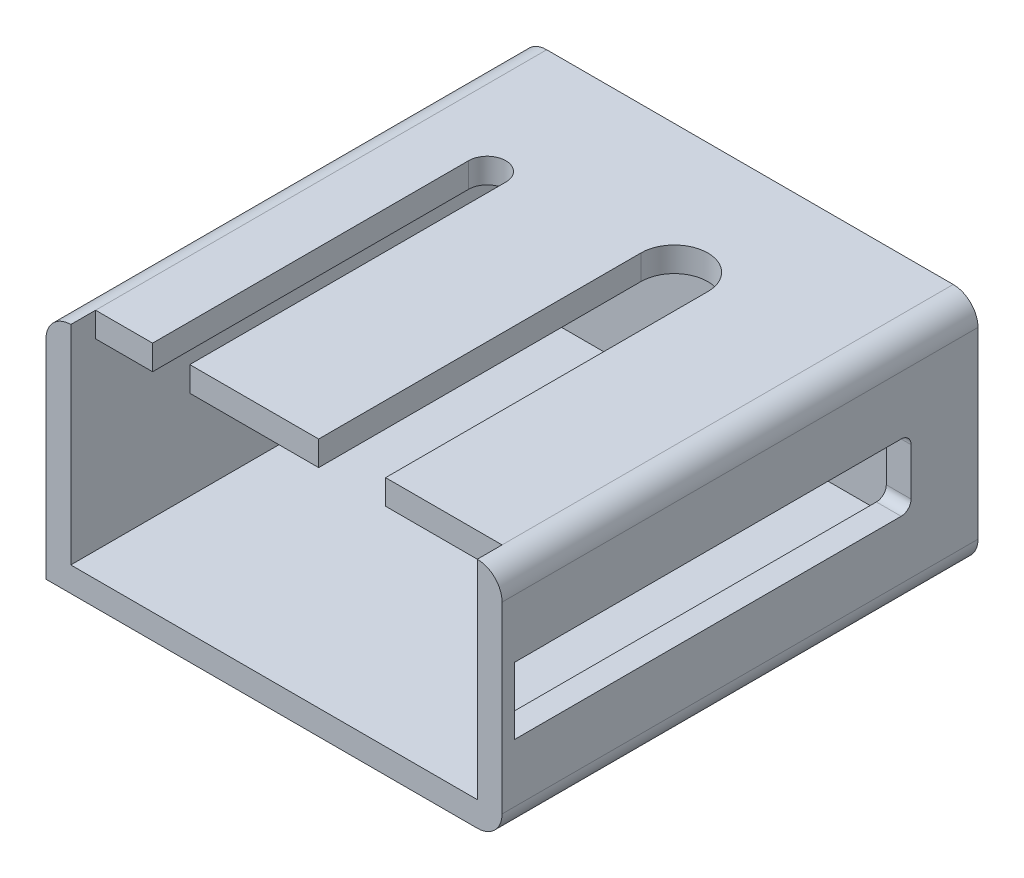
ISO-10303-21;
HEADER;
FILE_DESCRIPTION(('STEP AP214'),'2;1');
FILE_NAME('part.step','',(''),(''),'','','');
FILE_SCHEMA(('AUTOMOTIVE_DESIGN { 1 0 10303 214 1 1 1 1 }'));
ENDSEC;
DATA;
#1=APPLICATION_CONTEXT('core data for automotive mechanical design processes');
#2=APPLICATION_PROTOCOL_DEFINITION('international standard','automotive_design',2000,#1);
#3=PRODUCT_CONTEXT('',#1,'mechanical');
#4=PRODUCT('Part','Part','',(#3));
#5=PRODUCT_RELATED_PRODUCT_CATEGORY('part','',(#4));
#6=PRODUCT_DEFINITION_FORMATION('','',#4);
#7=PRODUCT_DEFINITION_CONTEXT('part definition',#1,'design');
#8=PRODUCT_DEFINITION('design','',#6,#7);
#9=PRODUCT_DEFINITION_SHAPE('','',#8);
#10=(LENGTH_UNIT() NAMED_UNIT(*) SI_UNIT(.MILLI.,.METRE.));
#11=(NAMED_UNIT(*) PLANE_ANGLE_UNIT() SI_UNIT($,.RADIAN.));
#12=(NAMED_UNIT(*) SI_UNIT($,.STERADIAN.) SOLID_ANGLE_UNIT());
#13=UNCERTAINTY_MEASURE_WITH_UNIT(LENGTH_MEASURE(1.E-05),#10,'distance_accuracy_value','');
#14=(GEOMETRIC_REPRESENTATION_CONTEXT(3) GLOBAL_UNCERTAINTY_ASSIGNED_CONTEXT((#13)) GLOBAL_UNIT_ASSIGNED_CONTEXT((#10,
#11,#12)) REPRESENTATION_CONTEXT('',''));
#15=CARTESIAN_POINT('',(0.,0.,0.));
#16=DIRECTION('',(0.,0.,1.));
#17=DIRECTION('',(1.,0.,0.));
#18=AXIS2_PLACEMENT_3D('',#15,#16,#17);
#19=CARTESIAN_POINT('',(82.,37.,-410.620424934226));
#20=DIRECTION('',(0.,1.,0.));
#21=DIRECTION('',(0.,0.,1.));
#22=AXIS2_PLACEMENT_3D('',#19,#20,#21);
#23=PLANE('',#22);
#24=DIRECTION('',(1.,0.,0.));
#25=VECTOR('',#24,1.);
#26=CARTESIAN_POINT('',(0.,37.,-10.));
#27=LINE('',#26,#25);
#28=CARTESIAN_POINT('',(35.0000000000001,37.,-10.));
#29=VERTEX_POINT('',#28);
#30=CARTESIAN_POINT('',(82.,37.,-10.));
#31=VERTEX_POINT('',#30);
#32=EDGE_CURVE('E851',#29,#31,#27,.T.);
#33=ORIENTED_EDGE('',*,*,#32,.F.);
#34=DIRECTION('',(0.,0.,1.));
#35=VECTOR('',#34,1.);
#36=CARTESIAN_POINT('',(35.0000000000001,37.,-140.));
#37=LINE('',#36,#35);
#38=CARTESIAN_POINT('',(35.0000000000001,37.,-140.));
#39=VERTEX_POINT('',#38);
#40=EDGE_CURVE('E819',#39,#29,#37,.T.);
#41=ORIENTED_EDGE('',*,*,#40,.F.);
#42=CARTESIAN_POINT('',(21.5000000000001,37.,-140.));
#43=DIRECTION('',(0.,1.,0.));
#44=DIRECTION('',(0.,0.,1.));
#45=AXIS2_PLACEMENT_3D('',#42,#43,#44);
#46=CIRCLE('',#45,13.5);
#47=CARTESIAN_POINT('',(8.00000000000007,37.,-140.));
#48=VERTEX_POINT('',#47);
#49=EDGE_CURVE('E808',#48,#39,#46,.F.);
#50=ORIENTED_EDGE('',*,*,#49,.F.);
#51=DIRECTION('',(0.,0.,-1.));
#52=VECTOR('',#51,1.);
#53=CARTESIAN_POINT('',(8.00000000000007,37.,-40.));
#54=LINE('',#53,#52);
#55=CARTESIAN_POINT('',(8.00000000000007,37.,-10.));
#56=VERTEX_POINT('',#55);
#57=EDGE_CURVE('E806',#56,#48,#54,.T.);
#58=ORIENTED_EDGE('',*,*,#57,.F.);
#59=DIRECTION('',(1.,0.,0.));
#60=VECTOR('',#59,1.);
#61=CARTESIAN_POINT('',(0.,37.,-10.));
#62=LINE('',#61,#60);
#63=CARTESIAN_POINT('',(-44.,37.,-10.));
#64=VERTEX_POINT('',#63);
#65=EDGE_CURVE('E859',#64,#56,#62,.T.);
#66=ORIENTED_EDGE('',*,*,#65,.F.);
#67=DIRECTION('',(0.,0.,1.));
#68=VECTOR('',#67,1.);
#69=CARTESIAN_POINT('',(-43.9999999999999,37.,-137.5));
#70=LINE('',#69,#68);
#71=CARTESIAN_POINT('',(-44.,37.,-137.5));
#72=VERTEX_POINT('',#71);
#73=EDGE_CURVE('E836',#72,#64,#70,.T.);
#74=ORIENTED_EDGE('',*,*,#73,.F.);
#75=CARTESIAN_POINT('',(-51.4999999999999,37.,-137.5));
#76=DIRECTION('',(0.,1.,0.));
#77=DIRECTION('',(0.,0.,1.));
#78=AXIS2_PLACEMENT_3D('',#75,#76,#77);
#79=CIRCLE('',#78,7.5);
#80=CARTESIAN_POINT('',(-58.9999999999999,37.,-137.5));
#81=VERTEX_POINT('',#80);
#82=EDGE_CURVE('E797',#81,#72,#79,.F.);
#83=ORIENTED_EDGE('',*,*,#82,.F.);
#84=DIRECTION('',(0.,0.,-1.));
#85=VECTOR('',#84,1.);
#86=CARTESIAN_POINT('',(-58.9999999999999,37.,-42.5));
#87=LINE('',#86,#85);
#88=CARTESIAN_POINT('',(-58.9999999999999,37.,-9.99999999999999));
#89=VERTEX_POINT('',#88);
#90=EDGE_CURVE('E245',#89,#81,#87,.T.);
#91=ORIENTED_EDGE('',*,*,#90,.F.);
#92=DIRECTION('',(1.,0.,0.));
#93=VECTOR('',#92,1.);
#94=CARTESIAN_POINT('',(0.,37.,-10.));
#95=LINE('',#94,#93);
#96=CARTESIAN_POINT('',(-82.,37.,-10.));
#97=VERTEX_POINT('',#96);
#98=EDGE_CURVE('E229',#97,#89,#95,.T.);
#99=ORIENTED_EDGE('',*,*,#98,.F.);
#100=DIRECTION('',(0.,0.,1.));
#101=VECTOR('',#100,1.);
#102=CARTESIAN_POINT('',(-82.,37.,-410.620424934226));
#103=LINE('',#102,#101);
#104=CARTESIAN_POINT('',(-82.,37.,-182.));
#105=VERTEX_POINT('',#104);
#106=EDGE_CURVE('E242',#105,#97,#103,.T.);
#107=ORIENTED_EDGE('',*,*,#106,.F.);
#108=DIRECTION('',(-1.,0.,0.));
#109=VECTOR('',#108,1.);
#110=CARTESIAN_POINT('',(82.,37.,-182.));
#111=LINE('',#110,#109);
#112=CARTESIAN_POINT('',(82.,37.,-182.));
#113=VERTEX_POINT('',#112);
#114=EDGE_CURVE('E301',#113,#105,#111,.T.);
#115=ORIENTED_EDGE('',*,*,#114,.F.);
#116=DIRECTION('',(0.,0.,1.));
#117=VECTOR('',#116,1.);
#118=CARTESIAN_POINT('',(82.,37.,-410.620424934226));
#119=LINE('',#118,#117);
#120=EDGE_CURVE('E319',#113,#31,#119,.T.);
#121=ORIENTED_EDGE('',*,*,#120,.T.);
#122=EDGE_LOOP('',(#33,#41,#50,#58,#66,#74,#83,#91,#99,#107,#115,#121));
#123=FACE_BOUND('',#122,.T.);
#124=ADVANCED_FACE('F39',(#123),#23,.F.);
#125=CARTESIAN_POINT('',(92.,47.,-410.620424934226));
#126=DIRECTION('',(0.,1.,0.));
#127=DIRECTION('',(0.,0.,1.));
#128=AXIS2_PLACEMENT_3D('',#125,#126,#127);
#129=PLANE('',#128);
#130=DIRECTION('',(-1.,0.,0.));
#131=VECTOR('',#130,1.);
#132=CARTESIAN_POINT('',(92.,47.,-192.));
#133=LINE('',#132,#131);
#134=CARTESIAN_POINT('',(82.,47.,-192.));
#135=VERTEX_POINT('',#134);
#136=CARTESIAN_POINT('',(-82.,47.,-192.));
#137=VERTEX_POINT('',#136);
#138=EDGE_CURVE('E312',#135,#137,#133,.T.);
#139=ORIENTED_EDGE('',*,*,#138,.T.);
#140=DIRECTION('',(0.,0.,1.));
#141=VECTOR('',#140,1.);
#142=CARTESIAN_POINT('',(-82.,47.,-410.620424934226));
#143=LINE('',#142,#141);
#144=CARTESIAN_POINT('',(-82.,47.,-10.));
#145=VERTEX_POINT('',#144);
#146=EDGE_CURVE('E267',#137,#145,#143,.T.);
#147=ORIENTED_EDGE('',*,*,#146,.T.);
#148=DIRECTION('',(1.,0.,0.));
#149=VECTOR('',#148,1.);
#150=CARTESIAN_POINT('',(0.,47.,-10.));
#151=LINE('',#150,#149);
#152=CARTESIAN_POINT('',(-58.9999999999999,47.,-10.));
#153=VERTEX_POINT('',#152);
#154=EDGE_CURVE('E232',#145,#153,#151,.T.);
#155=ORIENTED_EDGE('',*,*,#154,.T.);
#156=DIRECTION('',(0.,0.,1.));
#157=VECTOR('',#156,1.);
#158=CARTESIAN_POINT('',(-58.9999999999999,47.,-42.5));
#159=LINE('',#158,#157);
#160=CARTESIAN_POINT('',(-58.9999999999999,47.,-137.5));
#161=VERTEX_POINT('',#160);
#162=EDGE_CURVE('E841',#161,#153,#159,.T.);
#163=ORIENTED_EDGE('',*,*,#162,.F.);
#164=CARTESIAN_POINT('',(-51.4999999999999,47.,-137.5));
#165=DIRECTION('',(0.,1.,0.));
#166=DIRECTION('',(0.,0.,1.));
#167=AXIS2_PLACEMENT_3D('',#164,#165,#166);
#168=CIRCLE('',#167,7.5);
#169=CARTESIAN_POINT('',(-43.9999999999999,47.,-137.5));
#170=VERTEX_POINT('',#169);
#171=EDGE_CURVE('E838',#170,#161,#168,.T.);
#172=ORIENTED_EDGE('',*,*,#171,.F.);
#173=DIRECTION('',(0.,0.,-1.));
#174=VECTOR('',#173,1.);
#175=CARTESIAN_POINT('',(-43.9999999999999,47.,-137.5));
#176=LINE('',#175,#174);
#177=CARTESIAN_POINT('',(-44.,47.,-10.));
#178=VERTEX_POINT('',#177);
#179=EDGE_CURVE('E832',#178,#170,#176,.T.);
#180=ORIENTED_EDGE('',*,*,#179,.F.);
#181=DIRECTION('',(1.,0.,0.));
#182=VECTOR('',#181,1.);
#183=CARTESIAN_POINT('',(0.,47.,-10.));
#184=LINE('',#183,#182);
#185=CARTESIAN_POINT('',(8.00000000000007,47.,-10.));
#186=VERTEX_POINT('',#185);
#187=EDGE_CURVE('E861',#178,#186,#184,.T.);
#188=ORIENTED_EDGE('',*,*,#187,.T.);
#189=DIRECTION('',(0.,0.,1.));
#190=VECTOR('',#189,1.);
#191=CARTESIAN_POINT('',(8.00000000000007,47.,-40.));
#192=LINE('',#191,#190);
#193=CARTESIAN_POINT('',(8.00000000000008,47.,-140.));
#194=VERTEX_POINT('',#193);
#195=EDGE_CURVE('E811',#194,#186,#192,.T.);
#196=ORIENTED_EDGE('',*,*,#195,.F.);
#197=CARTESIAN_POINT('',(21.5000000000001,47.,-140.));
#198=DIRECTION('',(0.,1.,0.));
#199=DIRECTION('',(0.,0.,1.));
#200=AXIS2_PLACEMENT_3D('',#197,#198,#199);
#201=CIRCLE('',#200,13.5);
#202=CARTESIAN_POINT('',(35.0000000000001,47.,-140.));
#203=VERTEX_POINT('',#202);
#204=EDGE_CURVE('E814',#203,#194,#201,.T.);
#205=ORIENTED_EDGE('',*,*,#204,.F.);
#206=DIRECTION('',(0.,0.,-1.));
#207=VECTOR('',#206,1.);
#208=CARTESIAN_POINT('',(35.0000000000001,47.,-140.));
#209=LINE('',#208,#207);
#210=CARTESIAN_POINT('',(35.0000000000001,47.,-10.));
#211=VERTEX_POINT('',#210);
#212=EDGE_CURVE('E809',#211,#203,#209,.T.);
#213=ORIENTED_EDGE('',*,*,#212,.F.);
#214=DIRECTION('',(1.,0.,0.));
#215=VECTOR('',#214,1.);
#216=CARTESIAN_POINT('',(0.,47.,-10.));
#217=LINE('',#216,#215);
#218=CARTESIAN_POINT('',(82.,47.,-10.));
#219=VERTEX_POINT('',#218);
#220=EDGE_CURVE('E855',#211,#219,#217,.T.);
#221=ORIENTED_EDGE('',*,*,#220,.T.);
#222=DIRECTION('',(0.,0.,1.));
#223=VECTOR('',#222,1.);
#224=CARTESIAN_POINT('',(82.,47.,-410.620424934226));
#225=LINE('',#224,#223);
#226=EDGE_CURVE('E264',#219,#135,#225,.F.);
#227=ORIENTED_EDGE('',*,*,#226,.T.);
#228=EDGE_LOOP('',(#139,#147,#155,#163,#172,#180,#188,#196,#205,#213,#221,#227));
#229=FACE_BOUND('',#228,.T.);
#230=ADVANCED_FACE('F359',(#229),#129,.T.);
#231=CARTESIAN_POINT('',(0.,0.,0.));
#232=DIRECTION('',(0.,0.,1.));
#233=DIRECTION('',(1.,0.,0.));
#234=AXIS2_PLACEMENT_3D('',#231,#232,#233);
#235=PLANE('',#234);
#236=DIRECTION('',(0.,-1.,0.));
#237=VECTOR('',#236,1.);
#238=CARTESIAN_POINT('',(-82.,37.,0.));
#239=LINE('',#238,#237);
#240=CARTESIAN_POINT('',(-82.,47.,0.));
#241=VERTEX_POINT('',#240);
#242=CARTESIAN_POINT('',(-82.,-37.,0.));
#243=VERTEX_POINT('',#242);
#244=EDGE_CURVE('E251',#241,#243,#239,.T.);
#245=ORIENTED_EDGE('',*,*,#244,.F.);
#246=CARTESIAN_POINT('',(-82.,37.,0.));
#247=DIRECTION('',(0.,0.,1.));
#248=DIRECTION('',(1.,0.,0.));
#249=AXIS2_PLACEMENT_3D('',#246,#247,#248);
#250=CIRCLE('',#249,10.);
#251=CARTESIAN_POINT('',(-92.,37.,0.));
#252=VERTEX_POINT('',#251);
#253=EDGE_CURVE('E274',#241,#252,#250,.T.);
#254=ORIENTED_EDGE('',*,*,#253,.T.);
#255=DIRECTION('',(0.,-1.,0.));
#256=VECTOR('',#255,1.);
#257=CARTESIAN_POINT('',(-92.,47.,0.));
#258=LINE('',#257,#256);
#259=CARTESIAN_POINT('',(-92.,-47.,0.));
#260=VERTEX_POINT('',#259);
#261=EDGE_CURVE('E255',#252,#260,#258,.T.);
#262=ORIENTED_EDGE('',*,*,#261,.T.);
#263=DIRECTION('',(1.,0.,0.));
#264=VECTOR('',#263,1.);
#265=CARTESIAN_POINT('',(-92.,-47.,0.));
#266=LINE('',#265,#264);
#267=CARTESIAN_POINT('',(82.,-47.,0.));
#268=VERTEX_POINT('',#267);
#269=EDGE_CURVE('E297',#260,#268,#266,.T.);
#270=ORIENTED_EDGE('',*,*,#269,.T.);
#271=CARTESIAN_POINT('',(82.,-37.,0.));
#272=DIRECTION('',(0.,0.,1.));
#273=DIRECTION('',(1.,0.,0.));
#274=AXIS2_PLACEMENT_3D('',#271,#272,#273);
#275=CIRCLE('',#274,10.);
#276=CARTESIAN_POINT('',(92.,-37.,0.));
#277=VERTEX_POINT('',#276);
#278=EDGE_CURVE('E270',#268,#277,#275,.T.);
#279=ORIENTED_EDGE('',*,*,#278,.T.);
#280=DIRECTION('',(0.,1.,0.));
#281=VECTOR('',#280,1.);
#282=CARTESIAN_POINT('',(92.,-47.,0.));
#283=LINE('',#282,#281);
#284=CARTESIAN_POINT('',(92.,37.,0.));
#285=VERTEX_POINT('',#284);
#286=EDGE_CURVE('E265',#277,#285,#283,.T.);
#287=ORIENTED_EDGE('',*,*,#286,.T.);
#288=CARTESIAN_POINT('',(82.,37.,0.));
#289=DIRECTION('',(0.,0.,1.));
#290=DIRECTION('',(1.,0.,0.));
#291=AXIS2_PLACEMENT_3D('',#288,#289,#290);
#292=CIRCLE('',#291,10.);
#293=CARTESIAN_POINT('',(82.,47.,0.));
#294=VERTEX_POINT('',#293);
#295=EDGE_CURVE('E272',#285,#294,#292,.T.);
#296=ORIENTED_EDGE('',*,*,#295,.T.);
#297=DIRECTION('',(0.,1.,0.));
#298=VECTOR('',#297,1.);
#299=CARTESIAN_POINT('',(82.,-37.,0.));
#300=LINE('',#299,#298);
#301=CARTESIAN_POINT('',(82.,-37.,0.));
#302=VERTEX_POINT('',#301);
#303=EDGE_CURVE('E305',#302,#294,#300,.T.);
#304=ORIENTED_EDGE('',*,*,#303,.F.);
#305=DIRECTION('',(1.,0.,0.));
#306=VECTOR('',#305,1.);
#307=CARTESIAN_POINT('',(-82.,-37.,0.));
#308=LINE('',#307,#306);
#309=EDGE_CURVE('E252',#243,#302,#308,.T.);
#310=ORIENTED_EDGE('',*,*,#309,.F.);
#311=EDGE_LOOP('',(#245,#254,#262,#270,#279,#287,#296,#304,#310));
#312=FACE_BOUND('',#311,.T.);
#313=ADVANCED_FACE('F293',(#312),#235,.T.);
#314=CARTESIAN_POINT('',(-58.9999999999999,-47.001,-42.5));
#315=DIRECTION('',(-1.,0.,0.));
#316=DIRECTION('',(0.,0.,1.));
#317=AXIS2_PLACEMENT_3D('',#314,#315,#316);
#318=PLANE('',#317);
#319=DIRECTION('',(0.,1.,0.));
#320=VECTOR('',#319,1.);
#321=CARTESIAN_POINT('',(-58.9999999999999,37.,-10.));
#322=LINE('',#321,#320);
#323=EDGE_CURVE('E236',#89,#153,#322,.T.);
#324=ORIENTED_EDGE('',*,*,#323,.F.);
#325=ORIENTED_EDGE('',*,*,#90,.T.);
#326=DIRECTION('',(0.,1.,0.));
#327=VECTOR('',#326,1.);
#328=CARTESIAN_POINT('',(-58.9999999999999,-47.001,-137.5));
#329=LINE('',#328,#327);
#330=EDGE_CURVE('E828',#81,#161,#329,.T.);
#331=ORIENTED_EDGE('',*,*,#330,.T.);
#332=ORIENTED_EDGE('',*,*,#162,.T.);
#333=EDGE_LOOP('',(#324,#325,#331,#332));
#334=FACE_BOUND('',#333,.T.);
#335=ADVANCED_FACE('F434',(#334),#318,.F.);
#336=CARTESIAN_POINT('',(-43.9999999999999,-47.001,-137.5));
#337=DIRECTION('',(1.,0.,0.));
#338=DIRECTION('',(0.,0.,-1.));
#339=AXIS2_PLACEMENT_3D('',#336,#337,#338);
#340=PLANE('',#339);
#341=DIRECTION('',(0.,1.,0.));
#342=VECTOR('',#341,1.);
#343=CARTESIAN_POINT('',(-44.,37.,-10.));
#344=LINE('',#343,#342);
#345=EDGE_CURVE('E754',#64,#178,#344,.T.);
#346=ORIENTED_EDGE('',*,*,#345,.T.);
#347=ORIENTED_EDGE('',*,*,#179,.T.);
#348=DIRECTION('',(0.,1.,0.));
#349=VECTOR('',#348,1.);
#350=CARTESIAN_POINT('',(-43.9999999999999,-47.001,-137.5));
#351=LINE('',#350,#349);
#352=EDGE_CURVE('E829',#72,#170,#351,.T.);
#353=ORIENTED_EDGE('',*,*,#352,.F.);
#354=ORIENTED_EDGE('',*,*,#73,.T.);
#355=EDGE_LOOP('',(#346,#347,#353,#354));
#356=FACE_BOUND('',#355,.T.);
#357=ADVANCED_FACE('F428',(#356),#340,.F.);
#358=CARTESIAN_POINT('',(35.0000000000001,-47.001,-140.));
#359=DIRECTION('',(1.,0.,0.));
#360=DIRECTION('',(0.,0.,-1.));
#361=AXIS2_PLACEMENT_3D('',#358,#359,#360);
#362=PLANE('',#361);
#363=DIRECTION('',(0.,1.,0.));
#364=VECTOR('',#363,1.);
#365=CARTESIAN_POINT('',(35.0000000000001,37.,-10.));
#366=LINE('',#365,#364);
#367=EDGE_CURVE('E850',#29,#211,#366,.T.);
#368=ORIENTED_EDGE('',*,*,#367,.T.);
#369=ORIENTED_EDGE('',*,*,#212,.T.);
#370=DIRECTION('',(0.,1.,0.));
#371=VECTOR('',#370,1.);
#372=CARTESIAN_POINT('',(35.0000000000001,-47.001,-140.));
#373=LINE('',#372,#371);
#374=EDGE_CURVE('E816',#39,#203,#373,.T.);
#375=ORIENTED_EDGE('',*,*,#374,.F.);
#376=ORIENTED_EDGE('',*,*,#40,.T.);
#377=EDGE_LOOP('',(#368,#369,#375,#376));
#378=FACE_BOUND('',#377,.T.);
#379=ADVANCED_FACE('F424',(#378),#362,.F.);
#380=CARTESIAN_POINT('',(8.00000000000007,-47.001,-40.));
#381=DIRECTION('',(-1.,0.,0.));
#382=DIRECTION('',(0.,0.,1.));
#383=AXIS2_PLACEMENT_3D('',#380,#381,#382);
#384=PLANE('',#383);
#385=DIRECTION('',(0.,1.,0.));
#386=VECTOR('',#385,1.);
#387=CARTESIAN_POINT('',(8.00000000000007,37.,-10.));
#388=LINE('',#387,#386);
#389=EDGE_CURVE('E751',#56,#186,#388,.T.);
#390=ORIENTED_EDGE('',*,*,#389,.F.);
#391=ORIENTED_EDGE('',*,*,#57,.T.);
#392=DIRECTION('',(0.,1.,0.));
#393=VECTOR('',#392,1.);
#394=CARTESIAN_POINT('',(8.00000000000007,-47.001,-140.));
#395=LINE('',#394,#393);
#396=EDGE_CURVE('E825',#48,#194,#395,.T.);
#397=ORIENTED_EDGE('',*,*,#396,.T.);
#398=ORIENTED_EDGE('',*,*,#195,.T.);
#399=EDGE_LOOP('',(#390,#391,#397,#398));
#400=FACE_BOUND('',#399,.T.);
#401=ADVANCED_FACE('F421',(#400),#384,.F.);
#402=CARTESIAN_POINT('',(82.,-37.,-410.620424934226));
#403=DIRECTION('',(1.,0.,0.));
#404=DIRECTION('',(0.,0.,-1.));
#405=AXIS2_PLACEMENT_3D('',#402,#403,#404);
#406=PLANE('',#405);
#407=ORIENTED_EDGE('',*,*,#303,.T.);
#408=DIRECTION('',(0.,0.,-1.));
#409=VECTOR('',#408,1.);
#410=CARTESIAN_POINT('',(82.,47.,0.));
#411=LINE('',#410,#409);
#412=EDGE_CURVE('E848',#294,#219,#411,.T.);
#413=ORIENTED_EDGE('',*,*,#412,.T.);
#414=DIRECTION('',(0.,1.,0.));
#415=VECTOR('',#414,1.);
#416=CARTESIAN_POINT('',(82.,37.,-10.));
#417=LINE('',#416,#415);
#418=EDGE_CURVE('E847',#31,#219,#417,.T.);
#419=ORIENTED_EDGE('',*,*,#418,.F.);
#420=ORIENTED_EDGE('',*,*,#120,.F.);
#421=DIRECTION('',(0.,1.,0.));
#422=VECTOR('',#421,1.);
#423=CARTESIAN_POINT('',(82.,-37.,-182.));
#424=LINE('',#423,#422);
#425=CARTESIAN_POINT('',(82.,-37.,-182.));
#426=VERTEX_POINT('',#425);
#427=EDGE_CURVE('E329',#426,#113,#424,.T.);
#428=ORIENTED_EDGE('',*,*,#427,.F.);
#429=DIRECTION('',(0.,0.,1.));
#430=VECTOR('',#429,1.);
#431=CARTESIAN_POINT('',(82.,-37.,-410.620424934226));
#432=LINE('',#431,#430);
#433=EDGE_CURVE('E306',#426,#302,#432,.T.);
#434=ORIENTED_EDGE('',*,*,#433,.T.);
#435=EDGE_LOOP('',(#407,#413,#419,#420,#428,#434));
#436=FACE_BOUND('',#435,.T.);
#437=DIRECTION('',(0.,-1.,0.));
#438=VECTOR('',#437,1.);
#439=CARTESIAN_POINT('',(82.,13.4599107052823,-5.));
#440=LINE('',#439,#438);
#441=CARTESIAN_POINT('',(82.,13.4599107052823,-5.));
#442=VERTEX_POINT('',#441);
#443=CARTESIAN_POINT('',(82.,-13.5,-5.));
#444=VERTEX_POINT('',#443);
#445=EDGE_CURVE('E758',#442,#444,#440,.T.);
#446=ORIENTED_EDGE('',*,*,#445,.T.);
#447=DIRECTION('',(0.,0.,1.));
#448=VECTOR('',#447,1.);
#449=CARTESIAN_POINT('',(82.,-13.5,-19.));
#450=LINE('',#449,#448);
#451=CARTESIAN_POINT('',(82.,-13.5,-161.));
#452=VERTEX_POINT('',#451);
#453=EDGE_CURVE('E769',#452,#444,#450,.T.);
#454=ORIENTED_EDGE('',*,*,#453,.F.);
#455=CARTESIAN_POINT('',(82.,-9.49999999999998,-161.));
#456=DIRECTION('',(1.,0.,0.));
#457=DIRECTION('',(0.,0.,-1.));
#458=AXIS2_PLACEMENT_3D('',#455,#456,#457);
#459=CIRCLE('',#458,4.);
#460=CARTESIAN_POINT('',(82.,-9.49999999999995,-165.));
#461=VERTEX_POINT('',#460);
#462=EDGE_CURVE('E795',#461,#452,#459,.F.);
#463=ORIENTED_EDGE('',*,*,#462,.F.);
#464=DIRECTION('',(0.,-1.,0.));
#465=VECTOR('',#464,1.);
#466=CARTESIAN_POINT('',(82.,-9.49999999999995,-165.));
#467=LINE('',#466,#465);
#468=CARTESIAN_POINT('',(82.,9.49999999999999,-165.));
#469=VERTEX_POINT('',#468);
#470=EDGE_CURVE('E792',#469,#461,#467,.T.);
#471=ORIENTED_EDGE('',*,*,#470,.F.);
#472=CARTESIAN_POINT('',(82.,9.50000000000002,-161.));
#473=DIRECTION('',(1.,0.,0.));
#474=DIRECTION('',(0.,0.,-1.));
#475=AXIS2_PLACEMENT_3D('',#472,#473,#474);
#476=CIRCLE('',#475,4.);
#477=CARTESIAN_POINT('',(82.,13.5,-161.));
#478=VERTEX_POINT('',#477);
#479=EDGE_CURVE('E789',#478,#469,#476,.F.);
#480=ORIENTED_EDGE('',*,*,#479,.F.);
#481=DIRECTION('',(0.,0.,-1.));
#482=VECTOR('',#481,1.);
#483=CARTESIAN_POINT('',(82.,13.5,-161.));
#484=LINE('',#483,#482);
#485=CARTESIAN_POINT('',(82.,13.5,-19.));
#486=VERTEX_POINT('',#485);
#487=EDGE_CURVE('E786',#486,#478,#484,.T.);
#488=ORIENTED_EDGE('',*,*,#487,.F.);
#489=CARTESIAN_POINT('',(82.,9.50000000000002,-19.));
#490=DIRECTION('',(1.,0.,0.));
#491=DIRECTION('',(0.,0.,-1.));
#492=AXIS2_PLACEMENT_3D('',#489,#490,#491);
#493=CIRCLE('',#492,4.);
#494=CARTESIAN_POINT('',(82.,13.4599107052823,-18.4351042519274));
#495=VERTEX_POINT('',#494);
#496=EDGE_CURVE('E771',#495,#486,#493,.F.);
#497=ORIENTED_EDGE('',*,*,#496,.F.);
#498=DIRECTION('',(0.,0.,1.));
#499=VECTOR('',#498,1.);
#500=CARTESIAN_POINT('',(82.,13.4599107052823,-18.4351042519273));
#501=LINE('',#500,#499);
#502=EDGE_CURVE('E761',#495,#442,#501,.T.);
#503=ORIENTED_EDGE('',*,*,#502,.T.);
#504=EDGE_LOOP('',(#446,#454,#463,#471,#480,#488,#497,#503));
#505=FACE_BOUND('',#504,.T.);
#506=ADVANCED_FACE('F323',(#436,#505),#406,.F.);
#507=CARTESIAN_POINT('',(-82.,-37.,-410.620424934226));
#508=DIRECTION('',(0.,-1.,0.));
#509=DIRECTION('',(0.,0.,-1.));
#510=AXIS2_PLACEMENT_3D('',#507,#508,#509);
#511=PLANE('',#510);
#512=DIRECTION('',(1.,0.,0.));
#513=VECTOR('',#512,1.);
#514=CARTESIAN_POINT('',(-82.,-37.,-182.));
#515=LINE('',#514,#513);
#516=CARTESIAN_POINT('',(-82.,-37.,-182.));
#517=VERTEX_POINT('',#516);
#518=EDGE_CURVE('E822',#517,#426,#515,.T.);
#519=ORIENTED_EDGE('',*,*,#518,.F.);
#520=DIRECTION('',(0.,0.,1.));
#521=VECTOR('',#520,1.);
#522=CARTESIAN_POINT('',(-82.,-37.,-410.620424934226));
#523=LINE('',#522,#521);
#524=EDGE_CURVE('E258',#517,#243,#523,.T.);
#525=ORIENTED_EDGE('',*,*,#524,.T.);
#526=ORIENTED_EDGE('',*,*,#309,.T.);
#527=ORIENTED_EDGE('',*,*,#433,.F.);
#528=EDGE_LOOP('',(#519,#525,#526,#527));
#529=FACE_BOUND('',#528,.T.);
#530=ADVANCED_FACE('F334',(#529),#511,.F.);
#531=CARTESIAN_POINT('',(-82.,37.,-410.620424934226));
#532=DIRECTION('',(-1.,0.,0.));
#533=DIRECTION('',(0.,0.,1.));
#534=AXIS2_PLACEMENT_3D('',#531,#532,#533);
#535=PLANE('',#534);
#536=DIRECTION('',(0.,-1.,0.));
#537=VECTOR('',#536,1.);
#538=CARTESIAN_POINT('',(-82.,37.,-182.));
#539=LINE('',#538,#537);
#540=EDGE_CURVE('E250',#105,#517,#539,.T.);
#541=ORIENTED_EDGE('',*,*,#540,.F.);
#542=ORIENTED_EDGE('',*,*,#106,.T.);
#543=DIRECTION('',(0.,1.,0.));
#544=VECTOR('',#543,1.);
#545=CARTESIAN_POINT('',(-82.,37.,-10.));
#546=LINE('',#545,#544);
#547=EDGE_CURVE('E226',#97,#145,#546,.T.);
#548=ORIENTED_EDGE('',*,*,#547,.T.);
#549=DIRECTION('',(0.,0.,-1.));
#550=VECTOR('',#549,1.);
#551=CARTESIAN_POINT('',(-82.,47.,0.));
#552=LINE('',#551,#550);
#553=EDGE_CURVE('E246',#241,#145,#552,.T.);
#554=ORIENTED_EDGE('',*,*,#553,.F.);
#555=ORIENTED_EDGE('',*,*,#244,.T.);
#556=ORIENTED_EDGE('',*,*,#524,.F.);
#557=EDGE_LOOP('',(#541,#542,#548,#554,#555,#556));
#558=FACE_BOUND('',#557,.T.);
#559=ADVANCED_FACE('F248',(#558),#535,.F.);
#560=CARTESIAN_POINT('',(92.,-47.,-410.620424934226));
#561=DIRECTION('',(1.,0.,0.));
#562=DIRECTION('',(0.,0.,-1.));
#563=AXIS2_PLACEMENT_3D('',#560,#561,#562);
#564=PLANE('',#563);
#565=DIRECTION('',(0.,0.,-1.));
#566=VECTOR('',#565,1.);
#567=CARTESIAN_POINT('',(92.,-13.5,-19.));
#568=LINE('',#567,#566);
#569=CARTESIAN_POINT('',(92.,-13.5,-5.));
#570=VERTEX_POINT('',#569);
#571=CARTESIAN_POINT('',(92.,-13.5,-161.));
#572=VERTEX_POINT('',#571);
#573=EDGE_CURVE('E735',#570,#572,#568,.T.);
#574=ORIENTED_EDGE('',*,*,#573,.F.);
#575=DIRECTION('',(0.,1.,0.));
#576=VECTOR('',#575,1.);
#577=CARTESIAN_POINT('',(92.,13.4599107052823,-5.));
#578=LINE('',#577,#576);
#579=CARTESIAN_POINT('',(92.,13.4599107052823,-5.));
#580=VERTEX_POINT('',#579);
#581=EDGE_CURVE('E738',#570,#580,#578,.T.);
#582=ORIENTED_EDGE('',*,*,#581,.T.);
#583=DIRECTION('',(0.,0.,1.));
#584=VECTOR('',#583,1.);
#585=CARTESIAN_POINT('',(92.,13.4599107052823,-18.4351042519273));
#586=LINE('',#585,#584);
#587=CARTESIAN_POINT('',(92.,13.4599107052823,-18.4351042519273));
#588=VERTEX_POINT('',#587);
#589=EDGE_CURVE('E765',#588,#580,#586,.T.);
#590=ORIENTED_EDGE('',*,*,#589,.F.);
#591=CARTESIAN_POINT('',(92.,9.50000000000002,-19.));
#592=DIRECTION('',(1.,0.,0.));
#593=DIRECTION('',(0.,0.,-1.));
#594=AXIS2_PLACEMENT_3D('',#591,#592,#593);
#595=CIRCLE('',#594,4.);
#596=CARTESIAN_POINT('',(92.,13.5,-19.));
#597=VERTEX_POINT('',#596);
#598=EDGE_CURVE('E772',#597,#588,#595,.T.);
#599=ORIENTED_EDGE('',*,*,#598,.F.);
#600=DIRECTION('',(0.,0.,1.));
#601=VECTOR('',#600,1.);
#602=CARTESIAN_POINT('',(92.,13.5,-161.));
#603=LINE('',#602,#601);
#604=CARTESIAN_POINT('',(92.,13.5,-161.));
#605=VERTEX_POINT('',#604);
#606=EDGE_CURVE('E775',#605,#597,#603,.T.);
#607=ORIENTED_EDGE('',*,*,#606,.F.);
#608=CARTESIAN_POINT('',(92.,9.50000000000002,-161.));
#609=DIRECTION('',(1.,0.,0.));
#610=DIRECTION('',(0.,0.,-1.));
#611=AXIS2_PLACEMENT_3D('',#608,#609,#610);
#612=CIRCLE('',#611,4.);
#613=CARTESIAN_POINT('',(92.,9.49999999999999,-165.));
#614=VERTEX_POINT('',#613);
#615=EDGE_CURVE('E778',#614,#605,#612,.T.);
#616=ORIENTED_EDGE('',*,*,#615,.F.);
#617=DIRECTION('',(0.,1.,0.));
#618=VECTOR('',#617,1.);
#619=CARTESIAN_POINT('',(92.,-9.49999999999995,-165.));
#620=LINE('',#619,#618);
#621=CARTESIAN_POINT('',(92.,-9.49999999999995,-165.));
#622=VERTEX_POINT('',#621);
#623=EDGE_CURVE('E781',#622,#614,#620,.T.);
#624=ORIENTED_EDGE('',*,*,#623,.F.);
#625=CARTESIAN_POINT('',(92.,-9.49999999999998,-161.));
#626=DIRECTION('',(1.,0.,0.));
#627=DIRECTION('',(0.,0.,-1.));
#628=AXIS2_PLACEMENT_3D('',#625,#626,#627);
#629=CIRCLE('',#628,4.);
#630=EDGE_CURVE('E742',#572,#622,#629,.T.);
#631=ORIENTED_EDGE('',*,*,#630,.F.);
#632=EDGE_LOOP('',(#574,#582,#590,#599,#607,#616,#624,#631));
#633=FACE_BOUND('',#632,.T.);
#634=DIRECTION('',(0.,1.,0.));
#635=VECTOR('',#634,1.);
#636=CARTESIAN_POINT('',(92.,-47.,-192.));
#637=LINE('',#636,#635);
#638=CARTESIAN_POINT('',(92.,-37.,-192.));
#639=VERTEX_POINT('',#638);
#640=CARTESIAN_POINT('',(92.,37.,-192.));
#641=VERTEX_POINT('',#640);
#642=EDGE_CURVE('E290',#639,#641,#637,.T.);
#643=ORIENTED_EDGE('',*,*,#642,.T.);
#644=DIRECTION('',(0.,0.,1.));
#645=VECTOR('',#644,1.);
#646=CARTESIAN_POINT('',(92.,37.,-410.620424934226));
#647=LINE('',#646,#645);
#648=EDGE_CURVE('E47',#641,#285,#647,.T.);
#649=ORIENTED_EDGE('',*,*,#648,.T.);
#650=ORIENTED_EDGE('',*,*,#286,.F.);
#651=DIRECTION('',(0.,0.,1.));
#652=VECTOR('',#651,1.);
#653=CARTESIAN_POINT('',(92.,-37.,-410.620424934226));
#654=LINE('',#653,#652);
#655=EDGE_CURVE('E282',#277,#639,#654,.F.);
#656=ORIENTED_EDGE('',*,*,#655,.T.);
#657=EDGE_LOOP('',(#643,#649,#650,#656));
#658=FACE_BOUND('',#657,.T.);
#659=ADVANCED_FACE('F288',(#633,#658),#564,.T.);
#660=CARTESIAN_POINT('',(-92.,-47.,-410.620424934226));
#661=DIRECTION('',(0.,-1.,0.));
#662=DIRECTION('',(0.,0.,-1.));
#663=AXIS2_PLACEMENT_3D('',#660,#661,#662);
#664=PLANE('',#663);
#665=DIRECTION('',(1.,0.,0.));
#666=VECTOR('',#665,1.);
#667=CARTESIAN_POINT('',(-92.,-47.,-192.));
#668=LINE('',#667,#666);
#669=CARTESIAN_POINT('',(-92.,-47.,-192.));
#670=VERTEX_POINT('',#669);
#671=CARTESIAN_POINT('',(82.,-47.,-192.));
#672=VERTEX_POINT('',#671);
#673=EDGE_CURVE('E311',#670,#672,#668,.T.);
#674=ORIENTED_EDGE('',*,*,#673,.T.);
#675=DIRECTION('',(0.,0.,1.));
#676=VECTOR('',#675,1.);
#677=CARTESIAN_POINT('',(82.,-47.,-410.620424934226));
#678=LINE('',#677,#676);
#679=EDGE_CURVE('E11',#672,#268,#678,.T.);
#680=ORIENTED_EDGE('',*,*,#679,.T.);
#681=ORIENTED_EDGE('',*,*,#269,.F.);
#682=DIRECTION('',(0.,0.,1.));
#683=VECTOR('',#682,1.);
#684=CARTESIAN_POINT('',(-92.,-47.,-410.620424934226));
#685=LINE('',#684,#683);
#686=EDGE_CURVE('E310',#670,#260,#685,.T.);
#687=ORIENTED_EDGE('',*,*,#686,.F.);
#688=EDGE_LOOP('',(#674,#680,#681,#687));
#689=FACE_BOUND('',#688,.T.);
#690=ADVANCED_FACE('F351',(#689),#664,.T.);
#691=CARTESIAN_POINT('',(-92.,47.,-410.620424934226));
#692=DIRECTION('',(-1.,0.,0.));
#693=DIRECTION('',(0.,0.,1.));
#694=AXIS2_PLACEMENT_3D('',#691,#692,#693);
#695=PLANE('',#694);
#696=ORIENTED_EDGE('',*,*,#261,.F.);
#697=DIRECTION('',(0.,0.,1.));
#698=VECTOR('',#697,1.);
#699=CARTESIAN_POINT('',(-92.,37.,-410.620424934226));
#700=LINE('',#699,#698);
#701=CARTESIAN_POINT('',(-92.,37.,-192.));
#702=VERTEX_POINT('',#701);
#703=EDGE_CURVE('E276',#252,#702,#700,.F.);
#704=ORIENTED_EDGE('',*,*,#703,.T.);
#705=DIRECTION('',(0.,-1.,0.));
#706=VECTOR('',#705,1.);
#707=CARTESIAN_POINT('',(-92.,47.,-192.));
#708=LINE('',#707,#706);
#709=EDGE_CURVE('E308',#702,#670,#708,.T.);
#710=ORIENTED_EDGE('',*,*,#709,.T.);
#711=ORIENTED_EDGE('',*,*,#686,.T.);
#712=EDGE_LOOP('',(#696,#704,#710,#711));
#713=FACE_BOUND('',#712,.T.);
#714=ADVANCED_FACE('F345',(#713),#695,.T.);
#715=CARTESIAN_POINT('',(0.,0.,-192.));
#716=DIRECTION('',(0.,0.,-1.));
#717=DIRECTION('',(0.,-1.,0.));
#718=AXIS2_PLACEMENT_3D('',#715,#716,#717);
#719=PLANE('',#718);
#720=ORIENTED_EDGE('',*,*,#709,.F.);
#721=CARTESIAN_POINT('',(-82.,37.,-192.));
#722=DIRECTION('',(0.,0.,-1.));
#723=DIRECTION('',(-1.,0.,0.));
#724=AXIS2_PLACEMENT_3D('',#721,#722,#723);
#725=CIRCLE('',#724,10.);
#726=EDGE_CURVE('E280',#702,#137,#725,.T.);
#727=ORIENTED_EDGE('',*,*,#726,.T.);
#728=ORIENTED_EDGE('',*,*,#138,.F.);
#729=CARTESIAN_POINT('',(82.,37.,-192.));
#730=DIRECTION('',(0.,0.,-1.));
#731=DIRECTION('',(-1.,0.,0.));
#732=AXIS2_PLACEMENT_3D('',#729,#730,#731);
#733=CIRCLE('',#732,10.);
#734=EDGE_CURVE('E60',#135,#641,#733,.T.);
#735=ORIENTED_EDGE('',*,*,#734,.T.);
#736=ORIENTED_EDGE('',*,*,#642,.F.);
#737=CARTESIAN_POINT('',(82.,-37.,-192.));
#738=DIRECTION('',(0.,0.,-1.));
#739=DIRECTION('',(-1.,0.,0.));
#740=AXIS2_PLACEMENT_3D('',#737,#738,#739);
#741=CIRCLE('',#740,10.);
#742=EDGE_CURVE('E54',#639,#672,#741,.T.);
#743=ORIENTED_EDGE('',*,*,#742,.T.);
#744=ORIENTED_EDGE('',*,*,#673,.F.);
#745=EDGE_LOOP('',(#720,#727,#728,#735,#736,#743,#744));
#746=FACE_BOUND('',#745,.T.);
#747=ADVANCED_FACE('F346',(#746),#719,.T.);
#748=CARTESIAN_POINT('',(0.,0.,-182.));
#749=DIRECTION('',(0.,0.,-1.));
#750=DIRECTION('',(-1.,0.,0.));
#751=AXIS2_PLACEMENT_3D('',#748,#749,#750);
#752=PLANE('',#751);
#753=ORIENTED_EDGE('',*,*,#427,.T.);
#754=ORIENTED_EDGE('',*,*,#114,.T.);
#755=ORIENTED_EDGE('',*,*,#540,.T.);
#756=ORIENTED_EDGE('',*,*,#518,.T.);
#757=EDGE_LOOP('',(#753,#754,#755,#756));
#758=FACE_BOUND('',#757,.T.);
#759=ADVANCED_FACE('F371',(#758),#752,.F.);
#760=CARTESIAN_POINT('',(-51.4999999999999,-47.001,-137.5));
#761=DIRECTION('',(0.,1.,0.));
#762=DIRECTION('',(0.,0.,1.));
#763=AXIS2_PLACEMENT_3D('',#760,#761,#762);
#764=CYLINDRICAL_SURFACE('',#763,7.5);
#765=ORIENTED_EDGE('',*,*,#82,.T.);
#766=ORIENTED_EDGE('',*,*,#352,.T.);
#767=ORIENTED_EDGE('',*,*,#171,.T.);
#768=ORIENTED_EDGE('',*,*,#330,.F.);
#769=EDGE_LOOP('',(#765,#766,#767,#768));
#770=FACE_BOUND('',#769,.T.);
#771=ADVANCED_FACE('F432',(#770),#764,.F.);
#772=CARTESIAN_POINT('',(21.5000000000001,-47.001,-140.));
#773=DIRECTION('',(0.,1.,0.));
#774=DIRECTION('',(0.,0.,1.));
#775=AXIS2_PLACEMENT_3D('',#772,#773,#774);
#776=CYLINDRICAL_SURFACE('',#775,13.5);
#777=ORIENTED_EDGE('',*,*,#49,.T.);
#778=ORIENTED_EDGE('',*,*,#374,.T.);
#779=ORIENTED_EDGE('',*,*,#204,.T.);
#780=ORIENTED_EDGE('',*,*,#396,.F.);
#781=EDGE_LOOP('',(#777,#778,#779,#780));
#782=FACE_BOUND('',#781,.T.);
#783=ADVANCED_FACE('F419',(#782),#776,.F.);
#784=CARTESIAN_POINT('',(-92.001,9.50000000000002,-19.));
#785=DIRECTION('',(1.,0.,0.));
#786=DIRECTION('',(0.,0.,-1.));
#787=AXIS2_PLACEMENT_3D('',#784,#785,#786);
#788=CYLINDRICAL_SURFACE('',#787,4.);
#789=ORIENTED_EDGE('',*,*,#598,.T.);
#790=DIRECTION('',(1.,0.,0.));
#791=VECTOR('',#790,1.);
#792=CARTESIAN_POINT('',(82.,13.4599107052823,-18.4351042519273));
#793=LINE('',#792,#791);
#794=EDGE_CURVE('E764',#495,#588,#793,.T.);
#795=ORIENTED_EDGE('',*,*,#794,.F.);
#796=ORIENTED_EDGE('',*,*,#496,.T.);
#797=DIRECTION('',(1.,0.,0.));
#798=VECTOR('',#797,1.);
#799=CARTESIAN_POINT('',(-92.001,13.5,-19.));
#800=LINE('',#799,#798);
#801=EDGE_CURVE('E768',#486,#597,#800,.T.);
#802=ORIENTED_EDGE('',*,*,#801,.T.);
#803=EDGE_LOOP('',(#789,#795,#796,#802));
#804=FACE_BOUND('',#803,.T.);
#805=ADVANCED_FACE('F415',(#804),#788,.F.);
#806=CARTESIAN_POINT('',(-92.001,13.5,-161.));
#807=DIRECTION('',(0.,1.,0.));
#808=DIRECTION('',(0.,0.,1.));
#809=AXIS2_PLACEMENT_3D('',#806,#807,#808);
#810=PLANE('',#809);
#811=ORIENTED_EDGE('',*,*,#487,.T.);
#812=DIRECTION('',(1.,0.,0.));
#813=VECTOR('',#812,1.);
#814=CARTESIAN_POINT('',(-92.001,13.5,-161.));
#815=LINE('',#814,#813);
#816=EDGE_CURVE('E799',#478,#605,#815,.T.);
#817=ORIENTED_EDGE('',*,*,#816,.T.);
#818=ORIENTED_EDGE('',*,*,#606,.T.);
#819=ORIENTED_EDGE('',*,*,#801,.F.);
#820=EDGE_LOOP('',(#811,#817,#818,#819));
#821=FACE_BOUND('',#820,.T.);
#822=ADVANCED_FACE('F411',(#821),#810,.F.);
#823=CARTESIAN_POINT('',(-92.001,9.50000000000002,-161.));
#824=DIRECTION('',(1.,0.,0.));
#825=DIRECTION('',(0.,0.,-1.));
#826=AXIS2_PLACEMENT_3D('',#823,#824,#825);
#827=CYLINDRICAL_SURFACE('',#826,4.);
#828=ORIENTED_EDGE('',*,*,#479,.T.);
#829=DIRECTION('',(1.,0.,0.));
#830=VECTOR('',#829,1.);
#831=CARTESIAN_POINT('',(-92.001,9.49999999999999,-165.));
#832=LINE('',#831,#830);
#833=EDGE_CURVE('E801',#469,#614,#832,.T.);
#834=ORIENTED_EDGE('',*,*,#833,.T.);
#835=ORIENTED_EDGE('',*,*,#615,.T.);
#836=ORIENTED_EDGE('',*,*,#816,.F.);
#837=EDGE_LOOP('',(#828,#834,#835,#836));
#838=FACE_BOUND('',#837,.T.);
#839=ADVANCED_FACE('F407',(#838),#827,.F.);
#840=CARTESIAN_POINT('',(-92.001,-9.49999999999995,-165.));
#841=DIRECTION('',(0.,0.,-1.));
#842=DIRECTION('',(-1.,0.,0.));
#843=AXIS2_PLACEMENT_3D('',#840,#841,#842);
#844=PLANE('',#843);
#845=ORIENTED_EDGE('',*,*,#470,.T.);
#846=DIRECTION('',(1.,0.,0.));
#847=VECTOR('',#846,1.);
#848=CARTESIAN_POINT('',(-92.001,-9.49999999999995,-165.));
#849=LINE('',#848,#847);
#850=EDGE_CURVE('E803',#461,#622,#849,.T.);
#851=ORIENTED_EDGE('',*,*,#850,.T.);
#852=ORIENTED_EDGE('',*,*,#623,.T.);
#853=ORIENTED_EDGE('',*,*,#833,.F.);
#854=EDGE_LOOP('',(#845,#851,#852,#853));
#855=FACE_BOUND('',#854,.T.);
#856=ADVANCED_FACE('F403',(#855),#844,.F.);
#857=CARTESIAN_POINT('',(-92.001,-9.49999999999998,-161.));
#858=DIRECTION('',(1.,0.,0.));
#859=DIRECTION('',(0.,0.,-1.));
#860=AXIS2_PLACEMENT_3D('',#857,#858,#859);
#861=CYLINDRICAL_SURFACE('',#860,4.);
#862=ORIENTED_EDGE('',*,*,#462,.T.);
#863=DIRECTION('',(1.,0.,0.));
#864=VECTOR('',#863,1.);
#865=CARTESIAN_POINT('',(-92.001,-13.5,-161.));
#866=LINE('',#865,#864);
#867=EDGE_CURVE('E745',#452,#572,#866,.T.);
#868=ORIENTED_EDGE('',*,*,#867,.T.);
#869=ORIENTED_EDGE('',*,*,#630,.T.);
#870=ORIENTED_EDGE('',*,*,#850,.F.);
#871=EDGE_LOOP('',(#862,#868,#869,#870));
#872=FACE_BOUND('',#871,.T.);
#873=ADVANCED_FACE('F399',(#872),#861,.F.);
#874=CARTESIAN_POINT('',(-92.001,-13.5,-19.));
#875=DIRECTION('',(0.,-1.,0.));
#876=DIRECTION('',(0.,0.,-1.));
#877=AXIS2_PLACEMENT_3D('',#874,#875,#876);
#878=PLANE('',#877);
#879=ORIENTED_EDGE('',*,*,#453,.T.);
#880=DIRECTION('',(1.,0.,0.));
#881=VECTOR('',#880,1.);
#882=CARTESIAN_POINT('',(54.580357674893,-13.5,-5.));
#883=LINE('',#882,#881);
#884=EDGE_CURVE('E748',#444,#570,#883,.T.);
#885=ORIENTED_EDGE('',*,*,#884,.T.);
#886=ORIENTED_EDGE('',*,*,#573,.T.);
#887=ORIENTED_EDGE('',*,*,#867,.F.);
#888=EDGE_LOOP('',(#879,#885,#886,#887));
#889=FACE_BOUND('',#888,.T.);
#890=ADVANCED_FACE('F395',(#889),#878,.F.);
#891=CARTESIAN_POINT('',(82.,13.4599107052823,-18.4351042519273));
#892=DIRECTION('',(0.,1.,0.));
#893=DIRECTION('',(0.,0.,1.));
#894=AXIS2_PLACEMENT_3D('',#891,#892,#893);
#895=PLANE('',#894);
#896=ORIENTED_EDGE('',*,*,#589,.T.);
#897=DIRECTION('',(1.,0.,0.));
#898=VECTOR('',#897,1.);
#899=CARTESIAN_POINT('',(54.580357674893,13.4599107052823,-5.));
#900=LINE('',#899,#898);
#901=EDGE_CURVE('E750',#442,#580,#900,.T.);
#902=ORIENTED_EDGE('',*,*,#901,.F.);
#903=ORIENTED_EDGE('',*,*,#502,.F.);
#904=ORIENTED_EDGE('',*,*,#794,.T.);
#905=EDGE_LOOP('',(#896,#902,#903,#904));
#906=FACE_BOUND('',#905,.T.);
#907=ADVANCED_FACE('F391',(#906),#895,.F.);
#908=CARTESIAN_POINT('',(54.580357674893,13.4599107052823,-5.));
#909=DIRECTION('',(0.,0.,-1.));
#910=DIRECTION('',(0.,1.,0.));
#911=AXIS2_PLACEMENT_3D('',#908,#909,#910);
#912=PLANE('',#911);
#913=ORIENTED_EDGE('',*,*,#445,.F.);
#914=ORIENTED_EDGE('',*,*,#901,.T.);
#915=ORIENTED_EDGE('',*,*,#581,.F.);
#916=ORIENTED_EDGE('',*,*,#884,.F.);
#917=EDGE_LOOP('',(#913,#914,#915,#916));
#918=FACE_BOUND('',#917,.T.);
#919=ADVANCED_FACE('F387',(#918),#912,.T.);
#920=CARTESIAN_POINT('',(0.,37.,-10.));
#921=DIRECTION('',(0.,0.,1.));
#922=DIRECTION('',(1.,0.,0.));
#923=AXIS2_PLACEMENT_3D('',#920,#921,#922);
#924=PLANE('',#923);
#925=ORIENTED_EDGE('',*,*,#187,.F.);
#926=ORIENTED_EDGE('',*,*,#345,.F.);
#927=ORIENTED_EDGE('',*,*,#65,.T.);
#928=ORIENTED_EDGE('',*,*,#389,.T.);
#929=EDGE_LOOP('',(#925,#926,#927,#928));
#930=FACE_BOUND('',#929,.T.);
#931=ADVANCED_FACE('F381',(#930),#924,.T.);
#932=CARTESIAN_POINT('',(0.,37.,-10.));
#933=DIRECTION('',(0.,0.,1.));
#934=DIRECTION('',(1.,0.,0.));
#935=AXIS2_PLACEMENT_3D('',#932,#933,#934);
#936=PLANE('',#935);
#937=ORIENTED_EDGE('',*,*,#220,.F.);
#938=ORIENTED_EDGE('',*,*,#367,.F.);
#939=ORIENTED_EDGE('',*,*,#32,.T.);
#940=ORIENTED_EDGE('',*,*,#418,.T.);
#941=EDGE_LOOP('',(#937,#938,#939,#940));
#942=FACE_BOUND('',#941,.T.);
#943=ADVANCED_FACE('F376',(#942),#936,.T.);
#944=CARTESIAN_POINT('',(0.,37.,-10.));
#945=DIRECTION('',(0.,0.,1.));
#946=DIRECTION('',(1.,0.,0.));
#947=AXIS2_PLACEMENT_3D('',#944,#945,#946);
#948=PLANE('',#947);
#949=ORIENTED_EDGE('',*,*,#154,.F.);
#950=ORIENTED_EDGE('',*,*,#547,.F.);
#951=ORIENTED_EDGE('',*,*,#98,.T.);
#952=ORIENTED_EDGE('',*,*,#323,.T.);
#953=EDGE_LOOP('',(#949,#950,#951,#952));
#954=FACE_BOUND('',#953,.T.);
#955=ADVANCED_FACE('F228',(#954),#948,.T.);
#956=CARTESIAN_POINT('',(-82.,37.,-410.620424934226));
#957=DIRECTION('',(0.,0.,1.));
#958=DIRECTION('',(1.,0.,0.));
#959=AXIS2_PLACEMENT_3D('',#956,#957,#958);
#960=CYLINDRICAL_SURFACE('',#959,10.);
#961=ORIENTED_EDGE('',*,*,#726,.F.);
#962=ORIENTED_EDGE('',*,*,#703,.F.);
#963=ORIENTED_EDGE('',*,*,#253,.F.);
#964=ORIENTED_EDGE('',*,*,#553,.T.);
#965=ORIENTED_EDGE('',*,*,#146,.F.);
#966=EDGE_LOOP('',(#961,#962,#963,#964,#965));
#967=FACE_BOUND('',#966,.T.);
#968=ADVANCED_FACE('F342',(#967),#960,.T.);
#969=CARTESIAN_POINT('',(82.,37.,-410.620424934226));
#970=DIRECTION('',(0.,0.,1.));
#971=DIRECTION('',(1.,0.,0.));
#972=AXIS2_PLACEMENT_3D('',#969,#970,#971);
#973=CYLINDRICAL_SURFACE('',#972,10.);
#974=ORIENTED_EDGE('',*,*,#226,.F.);
#975=ORIENTED_EDGE('',*,*,#412,.F.);
#976=ORIENTED_EDGE('',*,*,#295,.F.);
#977=ORIENTED_EDGE('',*,*,#648,.F.);
#978=ORIENTED_EDGE('',*,*,#734,.F.);
#979=EDGE_LOOP('',(#974,#975,#976,#977,#978));
#980=FACE_BOUND('',#979,.T.);
#981=ADVANCED_FACE('F354',(#980),#973,.T.);
#982=CARTESIAN_POINT('',(82.,-37.,-410.620424934226));
#983=DIRECTION('',(0.,0.,1.));
#984=DIRECTION('',(1.,0.,0.));
#985=AXIS2_PLACEMENT_3D('',#982,#983,#984);
#986=CYLINDRICAL_SURFACE('',#985,10.);
#987=ORIENTED_EDGE('',*,*,#742,.F.);
#988=ORIENTED_EDGE('',*,*,#655,.F.);
#989=ORIENTED_EDGE('',*,*,#278,.F.);
#990=ORIENTED_EDGE('',*,*,#679,.F.);
#991=EDGE_LOOP('',(#987,#988,#989,#990));
#992=FACE_BOUND('',#991,.T.);
#993=ADVANCED_FACE('F41',(#992),#986,.T.);
#994=CLOSED_SHELL('',(#124,#230,#313,#335,#357,#379,#401,#506,#530,#559,#659,#690,#714,#747,
#759,#771,#783,#805,#822,#839,#856,#873,#890,#907,#919,#931,#943,#955,#968,#981,#993));
#995=MANIFOLD_SOLID_BREP('B2',#994);
#996=ADVANCED_BREP_SHAPE_REPRESENTATION('',(#18,#995),#14);
#997=SHAPE_DEFINITION_REPRESENTATION(#9,#996);
ENDSEC;
END-ISO-10303-21;
